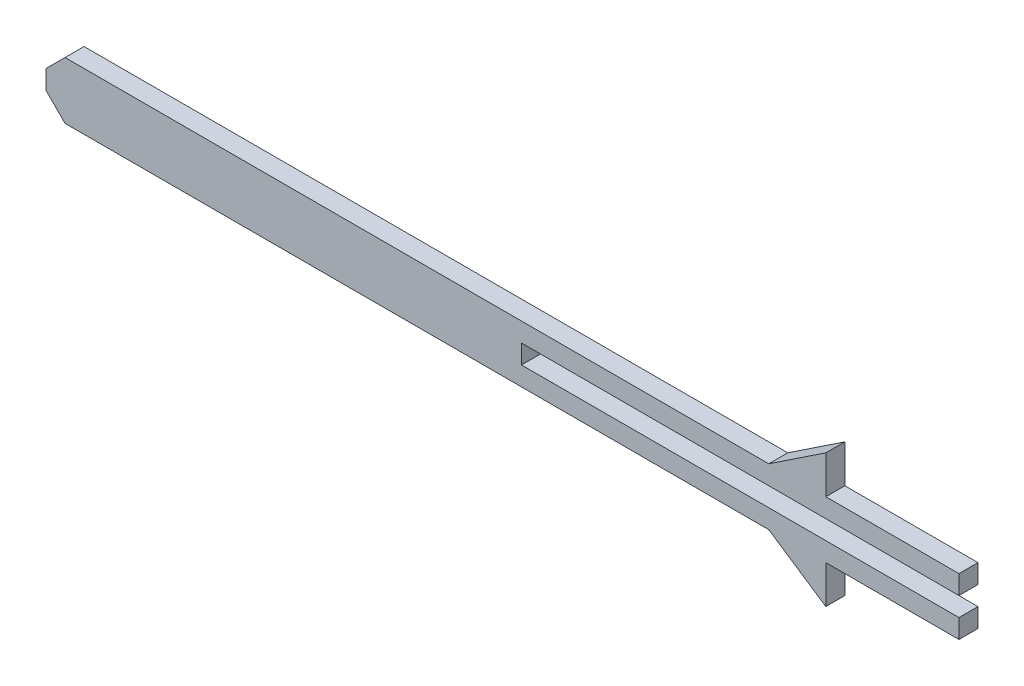
ISO-10303-21;
HEADER;
FILE_DESCRIPTION(('STEP AP214'),'2;1');
FILE_NAME('part.step','',(''),(''),'','','');
FILE_SCHEMA(('AUTOMOTIVE_DESIGN { 1 0 10303 214 1 1 1 1 }'));
ENDSEC;
DATA;
#1=APPLICATION_CONTEXT('core data for automotive mechanical design processes');
#2=APPLICATION_PROTOCOL_DEFINITION('international standard','automotive_design',2000,#1);
#3=PRODUCT_CONTEXT('',#1,'mechanical');
#4=PRODUCT('Part','Part','',(#3));
#5=PRODUCT_RELATED_PRODUCT_CATEGORY('part','',(#4));
#6=PRODUCT_DEFINITION_FORMATION('','',#4);
#7=PRODUCT_DEFINITION_CONTEXT('part definition',#1,'design');
#8=PRODUCT_DEFINITION('design','',#6,#7);
#9=PRODUCT_DEFINITION_SHAPE('','',#8);
#10=(LENGTH_UNIT() NAMED_UNIT(*) SI_UNIT(.MILLI.,.METRE.));
#11=(NAMED_UNIT(*) PLANE_ANGLE_UNIT() SI_UNIT($,.RADIAN.));
#12=(NAMED_UNIT(*) SI_UNIT($,.STERADIAN.) SOLID_ANGLE_UNIT());
#13=UNCERTAINTY_MEASURE_WITH_UNIT(LENGTH_MEASURE(1.E-05),#10,'distance_accuracy_value','');
#14=(GEOMETRIC_REPRESENTATION_CONTEXT(3) GLOBAL_UNCERTAINTY_ASSIGNED_CONTEXT((#13)) GLOBAL_UNIT_ASSIGNED_CONTEXT((#10,
#11,#12)) REPRESENTATION_CONTEXT('',''));
#15=CARTESIAN_POINT('',(0.,0.,0.));
#16=DIRECTION('',(0.,0.,1.));
#17=DIRECTION('',(1.,0.,0.));
#18=AXIS2_PLACEMENT_3D('',#15,#16,#17);
#19=CARTESIAN_POINT('',(492.942277064254,9.51412736958537,3.));
#20=DIRECTION('',(0.,1.,0.));
#21=DIRECTION('',(0.,0.,1.));
#22=AXIS2_PLACEMENT_3D('',#19,#20,#21);
#23=PLANE('',#22);
#24=DIRECTION('',(1.,0.,0.));
#25=VECTOR('',#24,1.);
#26=CARTESIAN_POINT('',(492.942277064254,9.51412736958537,0.));
#27=LINE('',#26,#25);
#28=CARTESIAN_POINT('',(471.942277064254,9.51412736958537,0.));
#29=VERTEX_POINT('',#28);
#30=CARTESIAN_POINT('',(492.942277064254,9.51412736958537,0.));
#31=VERTEX_POINT('',#30);
#32=EDGE_CURVE('E178',#29,#31,#27,.T.);
#33=ORIENTED_EDGE('',*,*,#32,.T.);
#34=DIRECTION('',(0.,0.,-1.));
#35=VECTOR('',#34,1.);
#36=CARTESIAN_POINT('',(492.942277064254,9.51412736958537,3.));
#37=LINE('',#36,#35);
#38=CARTESIAN_POINT('',(492.942277064254,9.51412736958537,3.));
#39=VERTEX_POINT('',#38);
#40=EDGE_CURVE('E11',#39,#31,#37,.T.);
#41=ORIENTED_EDGE('',*,*,#40,.F.);
#42=DIRECTION('',(1.,0.,0.));
#43=VECTOR('',#42,1.);
#44=CARTESIAN_POINT('',(492.942277064254,9.51412736958537,3.));
#45=LINE('',#44,#43);
#46=CARTESIAN_POINT('',(471.942277064254,9.51412736958537,3.));
#47=VERTEX_POINT('',#46);
#48=EDGE_CURVE('E208',#47,#39,#45,.T.);
#49=ORIENTED_EDGE('',*,*,#48,.F.);
#50=DIRECTION('',(0.,0.,-1.));
#51=VECTOR('',#50,1.);
#52=CARTESIAN_POINT('',(471.942277064254,9.51412736958537,3.));
#53=LINE('',#52,#51);
#54=EDGE_CURVE('E174',#47,#29,#53,.T.);
#55=ORIENTED_EDGE('',*,*,#54,.T.);
#56=EDGE_LOOP('',(#33,#41,#49,#55));
#57=FACE_BOUND('',#56,.T.);
#58=ADVANCED_FACE('F34',(#57),#23,.F.);
#59=CARTESIAN_POINT('',(492.942277064254,12.5141273695854,3.));
#60=DIRECTION('',(-1.,0.,0.));
#61=DIRECTION('',(0.,0.,1.));
#62=AXIS2_PLACEMENT_3D('',#59,#60,#61);
#63=PLANE('',#62);
#64=DIRECTION('',(0.,1.,0.));
#65=VECTOR('',#64,1.);
#66=CARTESIAN_POINT('',(492.942277064254,12.5141273695854,0.));
#67=LINE('',#66,#65);
#68=CARTESIAN_POINT('',(492.942277064254,12.5141273695854,0.));
#69=VERTEX_POINT('',#68);
#70=EDGE_CURVE('E181',#31,#69,#67,.T.);
#71=ORIENTED_EDGE('',*,*,#70,.T.);
#72=DIRECTION('',(0.,0.,-1.));
#73=VECTOR('',#72,1.);
#74=CARTESIAN_POINT('',(492.942277064254,12.5141273695854,3.));
#75=LINE('',#74,#73);
#76=CARTESIAN_POINT('',(492.942277064254,12.5141273695854,3.));
#77=VERTEX_POINT('',#76);
#78=EDGE_CURVE('E42',#77,#69,#75,.T.);
#79=ORIENTED_EDGE('',*,*,#78,.F.);
#80=DIRECTION('',(0.,1.,0.));
#81=VECTOR('',#80,1.);
#82=CARTESIAN_POINT('',(492.942277064254,12.5141273695854,3.));
#83=LINE('',#82,#81);
#84=EDGE_CURVE('E117',#39,#77,#83,.T.);
#85=ORIENTED_EDGE('',*,*,#84,.F.);
#86=ORIENTED_EDGE('',*,*,#40,.T.);
#87=EDGE_LOOP('',(#71,#79,#85,#86));
#88=FACE_BOUND('',#87,.T.);
#89=ADVANCED_FACE('F306',(#88),#63,.F.);
#90=CARTESIAN_POINT('',(423.942277064254,12.5141273695854,3.));
#91=DIRECTION('',(0.,-1.,0.));
#92=DIRECTION('',(0.,0.,-1.));
#93=AXIS2_PLACEMENT_3D('',#90,#91,#92);
#94=PLANE('',#93);
#95=DIRECTION('',(-1.,0.,0.));
#96=VECTOR('',#95,1.);
#97=CARTESIAN_POINT('',(423.942277064254,12.5141273695854,0.));
#98=LINE('',#97,#96);
#99=CARTESIAN_POINT('',(423.942277064254,12.5141273695854,0.));
#100=VERTEX_POINT('',#99);
#101=EDGE_CURVE('E183',#69,#100,#98,.T.);
#102=ORIENTED_EDGE('',*,*,#101,.T.);
#103=DIRECTION('',(0.,0.,-1.));
#104=VECTOR('',#103,1.);
#105=CARTESIAN_POINT('',(423.942277064254,12.5141273695854,3.));
#106=LINE('',#105,#104);
#107=CARTESIAN_POINT('',(423.942277064254,12.5141273695854,3.));
#108=VERTEX_POINT('',#107);
#109=EDGE_CURVE('E239',#108,#100,#106,.T.);
#110=ORIENTED_EDGE('',*,*,#109,.F.);
#111=DIRECTION('',(-1.,0.,0.));
#112=VECTOR('',#111,1.);
#113=CARTESIAN_POINT('',(423.942277064254,12.5141273695854,3.));
#114=LINE('',#113,#112);
#115=EDGE_CURVE('E247',#77,#108,#114,.T.);
#116=ORIENTED_EDGE('',*,*,#115,.F.);
#117=ORIENTED_EDGE('',*,*,#78,.T.);
#118=EDGE_LOOP('',(#102,#110,#116,#117));
#119=FACE_BOUND('',#118,.T.);
#120=ADVANCED_FACE('F245',(#119),#94,.F.);
#121=CARTESIAN_POINT('',(423.942277064254,15.5141273695854,3.));
#122=DIRECTION('',(-1.,0.,0.));
#123=DIRECTION('',(0.,0.,1.));
#124=AXIS2_PLACEMENT_3D('',#121,#122,#123);
#125=PLANE('',#124);
#126=DIRECTION('',(0.,1.,0.));
#127=VECTOR('',#126,1.);
#128=CARTESIAN_POINT('',(423.942277064254,15.5141273695854,0.));
#129=LINE('',#128,#127);
#130=CARTESIAN_POINT('',(423.942277064254,15.5141273695854,0.));
#131=VERTEX_POINT('',#130);
#132=EDGE_CURVE('E185',#100,#131,#129,.T.);
#133=ORIENTED_EDGE('',*,*,#132,.T.);
#134=DIRECTION('',(0.,0.,-1.));
#135=VECTOR('',#134,1.);
#136=CARTESIAN_POINT('',(423.942277064254,15.5141273695854,3.));
#137=LINE('',#136,#135);
#138=CARTESIAN_POINT('',(423.942277064254,15.5141273695854,3.));
#139=VERTEX_POINT('',#138);
#140=EDGE_CURVE('E236',#139,#131,#137,.T.);
#141=ORIENTED_EDGE('',*,*,#140,.F.);
#142=DIRECTION('',(0.,1.,0.));
#143=VECTOR('',#142,1.);
#144=CARTESIAN_POINT('',(423.942277064254,15.5141273695854,3.));
#145=LINE('',#144,#143);
#146=EDGE_CURVE('E265',#108,#139,#145,.T.);
#147=ORIENTED_EDGE('',*,*,#146,.F.);
#148=ORIENTED_EDGE('',*,*,#109,.T.);
#149=EDGE_LOOP('',(#133,#141,#147,#148));
#150=FACE_BOUND('',#149,.T.);
#151=ADVANCED_FACE('F256',(#150),#125,.F.);
#152=CARTESIAN_POINT('',(492.942277064254,15.5141273695854,3.));
#153=DIRECTION('',(0.,1.,0.));
#154=DIRECTION('',(0.,0.,1.));
#155=AXIS2_PLACEMENT_3D('',#152,#153,#154);
#156=PLANE('',#155);
#157=DIRECTION('',(1.,0.,0.));
#158=VECTOR('',#157,1.);
#159=CARTESIAN_POINT('',(492.942277064254,15.5141273695854,0.));
#160=LINE('',#159,#158);
#161=CARTESIAN_POINT('',(492.942277064254,15.5141273695854,0.));
#162=VERTEX_POINT('',#161);
#163=EDGE_CURVE('E187',#131,#162,#160,.T.);
#164=ORIENTED_EDGE('',*,*,#163,.T.);
#165=DIRECTION('',(0.,0.,-1.));
#166=VECTOR('',#165,1.);
#167=CARTESIAN_POINT('',(492.942277064254,15.5141273695854,3.));
#168=LINE('',#167,#166);
#169=CARTESIAN_POINT('',(492.942277064254,15.5141273695854,3.));
#170=VERTEX_POINT('',#169);
#171=EDGE_CURVE('E233',#170,#162,#168,.T.);
#172=ORIENTED_EDGE('',*,*,#171,.F.);
#173=DIRECTION('',(1.,0.,0.));
#174=VECTOR('',#173,1.);
#175=CARTESIAN_POINT('',(492.942277064254,15.5141273695854,3.));
#176=LINE('',#175,#174);
#177=EDGE_CURVE('E262',#139,#170,#176,.T.);
#178=ORIENTED_EDGE('',*,*,#177,.F.);
#179=ORIENTED_EDGE('',*,*,#140,.T.);
#180=EDGE_LOOP('',(#164,#172,#178,#179));
#181=FACE_BOUND('',#180,.T.);
#182=ADVANCED_FACE('F260',(#181),#156,.F.);
#183=CARTESIAN_POINT('',(492.942277064254,18.5141273695854,3.));
#184=DIRECTION('',(-1.,0.,0.));
#185=DIRECTION('',(0.,0.,1.));
#186=AXIS2_PLACEMENT_3D('',#183,#184,#185);
#187=PLANE('',#186);
#188=DIRECTION('',(0.,1.,0.));
#189=VECTOR('',#188,1.);
#190=CARTESIAN_POINT('',(492.942277064254,18.5141273695854,0.));
#191=LINE('',#190,#189);
#192=CARTESIAN_POINT('',(492.942277064254,18.5141273695854,0.));
#193=VERTEX_POINT('',#192);
#194=EDGE_CURVE('E189',#162,#193,#191,.T.);
#195=ORIENTED_EDGE('',*,*,#194,.T.);
#196=DIRECTION('',(0.,0.,-1.));
#197=VECTOR('',#196,1.);
#198=CARTESIAN_POINT('',(492.942277064254,18.5141273695854,3.));
#199=LINE('',#198,#197);
#200=CARTESIAN_POINT('',(492.942277064254,18.5141273695854,3.));
#201=VERTEX_POINT('',#200);
#202=EDGE_CURVE('E230',#201,#193,#199,.T.);
#203=ORIENTED_EDGE('',*,*,#202,.F.);
#204=DIRECTION('',(0.,1.,0.));
#205=VECTOR('',#204,1.);
#206=CARTESIAN_POINT('',(492.942277064254,18.5141273695854,3.));
#207=LINE('',#206,#205);
#208=EDGE_CURVE('E264',#170,#201,#207,.T.);
#209=ORIENTED_EDGE('',*,*,#208,.F.);
#210=ORIENTED_EDGE('',*,*,#171,.T.);
#211=EDGE_LOOP('',(#195,#203,#209,#210));
#212=FACE_BOUND('',#211,.T.);
#213=ADVANCED_FACE('F319',(#212),#187,.F.);
#214=CARTESIAN_POINT('',(471.942277064254,18.5141273695854,3.));
#215=DIRECTION('',(0.,-1.,0.));
#216=DIRECTION('',(0.,0.,-1.));
#217=AXIS2_PLACEMENT_3D('',#214,#215,#216);
#218=PLANE('',#217);
#219=DIRECTION('',(-1.,0.,0.));
#220=VECTOR('',#219,1.);
#221=CARTESIAN_POINT('',(471.942277064254,18.5141273695854,0.));
#222=LINE('',#221,#220);
#223=CARTESIAN_POINT('',(471.942277064254,18.5141273695854,0.));
#224=VERTEX_POINT('',#223);
#225=EDGE_CURVE('E191',#193,#224,#222,.T.);
#226=ORIENTED_EDGE('',*,*,#225,.T.);
#227=DIRECTION('',(0.,0.,-1.));
#228=VECTOR('',#227,1.);
#229=CARTESIAN_POINT('',(471.942277064254,18.5141273695854,3.));
#230=LINE('',#229,#228);
#231=CARTESIAN_POINT('',(471.942277064254,18.5141273695854,3.));
#232=VERTEX_POINT('',#231);
#233=EDGE_CURVE('E227',#232,#224,#230,.T.);
#234=ORIENTED_EDGE('',*,*,#233,.F.);
#235=DIRECTION('',(-1.,0.,0.));
#236=VECTOR('',#235,1.);
#237=CARTESIAN_POINT('',(471.942277064254,18.5141273695854,3.));
#238=LINE('',#237,#236);
#239=EDGE_CURVE('E267',#201,#232,#238,.T.);
#240=ORIENTED_EDGE('',*,*,#239,.F.);
#241=ORIENTED_EDGE('',*,*,#202,.T.);
#242=EDGE_LOOP('',(#226,#234,#240,#241));
#243=FACE_BOUND('',#242,.T.);
#244=ADVANCED_FACE('F322',(#243),#218,.F.);
#245=CARTESIAN_POINT('',(471.942277064254,24.5141273695854,3.));
#246=DIRECTION('',(-1.,0.,0.));
#247=DIRECTION('',(0.,0.,1.));
#248=AXIS2_PLACEMENT_3D('',#245,#246,#247);
#249=PLANE('',#248);
#250=DIRECTION('',(0.,1.,0.));
#251=VECTOR('',#250,1.);
#252=CARTESIAN_POINT('',(471.942277064254,24.5141273695854,0.));
#253=LINE('',#252,#251);
#254=CARTESIAN_POINT('',(471.942277064254,24.5141273695854,0.));
#255=VERTEX_POINT('',#254);
#256=EDGE_CURVE('E193',#224,#255,#253,.T.);
#257=ORIENTED_EDGE('',*,*,#256,.T.);
#258=DIRECTION('',(0.,0.,-1.));
#259=VECTOR('',#258,1.);
#260=CARTESIAN_POINT('',(471.942277064254,24.5141273695854,3.));
#261=LINE('',#260,#259);
#262=CARTESIAN_POINT('',(471.942277064254,24.5141273695854,3.));
#263=VERTEX_POINT('',#262);
#264=EDGE_CURVE('E224',#263,#255,#261,.T.);
#265=ORIENTED_EDGE('',*,*,#264,.F.);
#266=DIRECTION('',(0.,1.,0.));
#267=VECTOR('',#266,1.);
#268=CARTESIAN_POINT('',(471.942277064254,24.5141273695854,3.));
#269=LINE('',#268,#267);
#270=EDGE_CURVE('E273',#232,#263,#269,.T.);
#271=ORIENTED_EDGE('',*,*,#270,.F.);
#272=ORIENTED_EDGE('',*,*,#233,.T.);
#273=EDGE_LOOP('',(#257,#265,#271,#272));
#274=FACE_BOUND('',#273,.T.);
#275=ADVANCED_FACE('F326',(#274),#249,.F.);
#276=CARTESIAN_POINT('',(462.942277064254,18.5141273695854,3.));
#277=DIRECTION('',(0.554700196225231,-0.832050294337842,0.));
#278=DIRECTION('',(0.832050294337842,0.554700196225231,0.));
#279=AXIS2_PLACEMENT_3D('',#276,#277,#278);
#280=PLANE('',#279);
#281=DIRECTION('',(-0.832050294337842,-0.554700196225231,0.));
#282=VECTOR('',#281,1.);
#283=CARTESIAN_POINT('',(462.942277064254,18.5141273695854,0.));
#284=LINE('',#283,#282);
#285=CARTESIAN_POINT('',(462.942277064254,18.5141273695854,0.));
#286=VERTEX_POINT('',#285);
#287=EDGE_CURVE('E195',#255,#286,#284,.T.);
#288=ORIENTED_EDGE('',*,*,#287,.T.);
#289=DIRECTION('',(0.,0.,-1.));
#290=VECTOR('',#289,1.);
#291=CARTESIAN_POINT('',(462.942277064254,18.5141273695854,3.));
#292=LINE('',#291,#290);
#293=CARTESIAN_POINT('',(462.942277064254,18.5141273695854,3.));
#294=VERTEX_POINT('',#293);
#295=EDGE_CURVE('E221',#294,#286,#292,.T.);
#296=ORIENTED_EDGE('',*,*,#295,.F.);
#297=DIRECTION('',(-0.832050294337842,-0.554700196225231,0.));
#298=VECTOR('',#297,1.);
#299=CARTESIAN_POINT('',(462.942277064254,18.5141273695854,3.));
#300=LINE('',#299,#298);
#301=EDGE_CURVE('E275',#263,#294,#300,.T.);
#302=ORIENTED_EDGE('',*,*,#301,.F.);
#303=ORIENTED_EDGE('',*,*,#264,.T.);
#304=EDGE_LOOP('',(#288,#296,#302,#303));
#305=FACE_BOUND('',#304,.T.);
#306=ADVANCED_FACE('F330',(#305),#280,.F.);
#307=CARTESIAN_POINT('',(351.942277064254,18.5141273695854,3.));
#308=DIRECTION('',(0.,-1.,0.));
#309=DIRECTION('',(0.,0.,-1.));
#310=AXIS2_PLACEMENT_3D('',#307,#308,#309);
#311=PLANE('',#310);
#312=DIRECTION('',(-1.,0.,0.));
#313=VECTOR('',#312,1.);
#314=CARTESIAN_POINT('',(351.942277064254,18.5141273695854,0.));
#315=LINE('',#314,#313);
#316=CARTESIAN_POINT('',(351.942277064254,18.5141273695854,0.));
#317=VERTEX_POINT('',#316);
#318=EDGE_CURVE('E197',#286,#317,#315,.T.);
#319=ORIENTED_EDGE('',*,*,#318,.T.);
#320=DIRECTION('',(0.,0.,-1.));
#321=VECTOR('',#320,1.);
#322=CARTESIAN_POINT('',(351.942277064254,18.5141273695854,3.));
#323=LINE('',#322,#321);
#324=CARTESIAN_POINT('',(351.942277064254,18.5141273695854,3.));
#325=VERTEX_POINT('',#324);
#326=EDGE_CURVE('E218',#325,#317,#323,.T.);
#327=ORIENTED_EDGE('',*,*,#326,.F.);
#328=DIRECTION('',(-1.,0.,0.));
#329=VECTOR('',#328,1.);
#330=CARTESIAN_POINT('',(351.942277064254,18.5141273695854,3.));
#331=LINE('',#330,#329);
#332=EDGE_CURVE('E277',#294,#325,#331,.T.);
#333=ORIENTED_EDGE('',*,*,#332,.F.);
#334=ORIENTED_EDGE('',*,*,#295,.T.);
#335=EDGE_LOOP('',(#319,#327,#333,#334));
#336=FACE_BOUND('',#335,.T.);
#337=ADVANCED_FACE('F334',(#336),#311,.F.);
#338=CARTESIAN_POINT('',(348.942277064254,15.5141273695854,3.));
#339=DIRECTION('',(0.707106781186547,-0.707106781186548,0.));
#340=DIRECTION('',(0.707106781186548,0.707106781186547,0.));
#341=AXIS2_PLACEMENT_3D('',#338,#339,#340);
#342=PLANE('',#341);
#343=DIRECTION('',(-0.707106781186548,-0.707106781186547,0.));
#344=VECTOR('',#343,1.);
#345=CARTESIAN_POINT('',(348.942277064254,15.5141273695854,0.));
#346=LINE('',#345,#344);
#347=CARTESIAN_POINT('',(348.942277064254,15.5141273695854,0.));
#348=VERTEX_POINT('',#347);
#349=EDGE_CURVE('E199',#317,#348,#346,.T.);
#350=ORIENTED_EDGE('',*,*,#349,.T.);
#351=DIRECTION('',(0.,0.,-1.));
#352=VECTOR('',#351,1.);
#353=CARTESIAN_POINT('',(348.942277064254,15.5141273695854,3.));
#354=LINE('',#353,#352);
#355=CARTESIAN_POINT('',(348.942277064254,15.5141273695854,3.));
#356=VERTEX_POINT('',#355);
#357=EDGE_CURVE('E215',#356,#348,#354,.T.);
#358=ORIENTED_EDGE('',*,*,#357,.F.);
#359=DIRECTION('',(-0.707106781186548,-0.707106781186547,0.));
#360=VECTOR('',#359,1.);
#361=CARTESIAN_POINT('',(348.942277064254,15.5141273695854,3.));
#362=LINE('',#361,#360);
#363=EDGE_CURVE('E279',#325,#356,#362,.T.);
#364=ORIENTED_EDGE('',*,*,#363,.F.);
#365=ORIENTED_EDGE('',*,*,#326,.T.);
#366=EDGE_LOOP('',(#350,#358,#364,#365));
#367=FACE_BOUND('',#366,.T.);
#368=ADVANCED_FACE('F338',(#367),#342,.F.);
#369=CARTESIAN_POINT('',(348.942277064254,12.5141273695854,3.));
#370=DIRECTION('',(1.,0.,0.));
#371=DIRECTION('',(0.,0.,-1.));
#372=AXIS2_PLACEMENT_3D('',#369,#370,#371);
#373=PLANE('',#372);
#374=DIRECTION('',(0.,-1.,0.));
#375=VECTOR('',#374,1.);
#376=CARTESIAN_POINT('',(348.942277064254,12.5141273695854,0.));
#377=LINE('',#376,#375);
#378=CARTESIAN_POINT('',(348.942277064254,12.5141273695854,0.));
#379=VERTEX_POINT('',#378);
#380=EDGE_CURVE('E201',#348,#379,#377,.T.);
#381=ORIENTED_EDGE('',*,*,#380,.T.);
#382=DIRECTION('',(0.,0.,-1.));
#383=VECTOR('',#382,1.);
#384=CARTESIAN_POINT('',(348.942277064254,12.5141273695854,3.));
#385=LINE('',#384,#383);
#386=CARTESIAN_POINT('',(348.942277064254,12.5141273695854,3.));
#387=VERTEX_POINT('',#386);
#388=EDGE_CURVE('E212',#387,#379,#385,.T.);
#389=ORIENTED_EDGE('',*,*,#388,.F.);
#390=DIRECTION('',(0.,-1.,0.));
#391=VECTOR('',#390,1.);
#392=CARTESIAN_POINT('',(348.942277064254,12.5141273695854,3.));
#393=LINE('',#392,#391);
#394=EDGE_CURVE('E281',#356,#387,#393,.T.);
#395=ORIENTED_EDGE('',*,*,#394,.F.);
#396=ORIENTED_EDGE('',*,*,#357,.T.);
#397=EDGE_LOOP('',(#381,#389,#395,#396));
#398=FACE_BOUND('',#397,.T.);
#399=ADVANCED_FACE('F287',(#398),#373,.F.);
#400=CARTESIAN_POINT('',(351.942277064254,9.51412736958537,3.));
#401=DIRECTION('',(0.707106781186547,0.707106781186548,0.));
#402=DIRECTION('',(-0.707106781186548,0.707106781186547,0.));
#403=AXIS2_PLACEMENT_3D('',#400,#401,#402);
#404=PLANE('',#403);
#405=DIRECTION('',(0.707106781186548,-0.707106781186547,0.));
#406=VECTOR('',#405,1.);
#407=CARTESIAN_POINT('',(351.942277064254,9.51412736958537,0.));
#408=LINE('',#407,#406);
#409=CARTESIAN_POINT('',(351.942277064254,9.51412736958537,0.));
#410=VERTEX_POINT('',#409);
#411=EDGE_CURVE('E203',#379,#410,#408,.T.);
#412=ORIENTED_EDGE('',*,*,#411,.T.);
#413=DIRECTION('',(0.,0.,-1.));
#414=VECTOR('',#413,1.);
#415=CARTESIAN_POINT('',(351.942277064254,9.51412736958537,3.));
#416=LINE('',#415,#414);
#417=CARTESIAN_POINT('',(351.942277064254,9.51412736958537,3.));
#418=VERTEX_POINT('',#417);
#419=EDGE_CURVE('E169',#418,#410,#416,.T.);
#420=ORIENTED_EDGE('',*,*,#419,.F.);
#421=DIRECTION('',(0.707106781186548,-0.707106781186547,0.));
#422=VECTOR('',#421,1.);
#423=CARTESIAN_POINT('',(351.942277064254,9.51412736958537,3.));
#424=LINE('',#423,#422);
#425=EDGE_CURVE('E160',#387,#418,#424,.T.);
#426=ORIENTED_EDGE('',*,*,#425,.F.);
#427=ORIENTED_EDGE('',*,*,#388,.T.);
#428=EDGE_LOOP('',(#412,#420,#426,#427));
#429=FACE_BOUND('',#428,.T.);
#430=ADVANCED_FACE('F291',(#429),#404,.F.);
#431=CARTESIAN_POINT('',(462.942277064254,9.51412736958537,3.));
#432=DIRECTION('',(0.,1.,0.));
#433=DIRECTION('',(0.,0.,1.));
#434=AXIS2_PLACEMENT_3D('',#431,#432,#433);
#435=PLANE('',#434);
#436=DIRECTION('',(1.,0.,0.));
#437=VECTOR('',#436,1.);
#438=CARTESIAN_POINT('',(462.942277064254,9.51412736958537,0.));
#439=LINE('',#438,#437);
#440=CARTESIAN_POINT('',(462.942277064254,9.51412736958537,0.));
#441=VERTEX_POINT('',#440);
#442=EDGE_CURVE('E168',#410,#441,#439,.T.);
#443=ORIENTED_EDGE('',*,*,#442,.T.);
#444=DIRECTION('',(0.,0.,-1.));
#445=VECTOR('',#444,1.);
#446=CARTESIAN_POINT('',(462.942277064254,9.51412736958537,3.));
#447=LINE('',#446,#445);
#448=CARTESIAN_POINT('',(462.942277064254,9.51412736958537,3.));
#449=VERTEX_POINT('',#448);
#450=EDGE_CURVE('E165',#449,#441,#447,.T.);
#451=ORIENTED_EDGE('',*,*,#450,.F.);
#452=DIRECTION('',(1.,0.,0.));
#453=VECTOR('',#452,1.);
#454=CARTESIAN_POINT('',(462.942277064254,9.51412736958537,3.));
#455=LINE('',#454,#453);
#456=EDGE_CURVE('E154',#418,#449,#455,.T.);
#457=ORIENTED_EDGE('',*,*,#456,.F.);
#458=ORIENTED_EDGE('',*,*,#419,.T.);
#459=EDGE_LOOP('',(#443,#451,#457,#458));
#460=FACE_BOUND('',#459,.T.);
#461=ADVANCED_FACE('F166',(#460),#435,.F.);
#462=CARTESIAN_POINT('',(471.942277064254,3.51412736958537,3.));
#463=DIRECTION('',(0.554700196225231,0.832050294337842,0.));
#464=DIRECTION('',(-0.832050294337842,0.554700196225231,0.));
#465=AXIS2_PLACEMENT_3D('',#462,#463,#464);
#466=PLANE('',#465);
#467=DIRECTION('',(0.832050294337842,-0.554700196225231,0.));
#468=VECTOR('',#467,1.);
#469=CARTESIAN_POINT('',(471.942277064254,3.51412736958537,0.));
#470=LINE('',#469,#468);
#471=CARTESIAN_POINT('',(471.942277064254,3.51412736958537,0.));
#472=VERTEX_POINT('',#471);
#473=EDGE_CURVE('E103',#441,#472,#470,.T.);
#474=ORIENTED_EDGE('',*,*,#473,.T.);
#475=DIRECTION('',(0.,0.,-1.));
#476=VECTOR('',#475,1.);
#477=CARTESIAN_POINT('',(471.942277064254,3.51412736958537,3.));
#478=LINE('',#477,#476);
#479=CARTESIAN_POINT('',(471.942277064254,3.51412736958537,3.));
#480=VERTEX_POINT('',#479);
#481=EDGE_CURVE('E170',#480,#472,#478,.T.);
#482=ORIENTED_EDGE('',*,*,#481,.F.);
#483=DIRECTION('',(0.832050294337842,-0.554700196225231,0.));
#484=VECTOR('',#483,1.);
#485=CARTESIAN_POINT('',(471.942277064254,3.51412736958537,3.));
#486=LINE('',#485,#484);
#487=EDGE_CURVE('E158',#449,#480,#486,.T.);
#488=ORIENTED_EDGE('',*,*,#487,.F.);
#489=ORIENTED_EDGE('',*,*,#450,.T.);
#490=EDGE_LOOP('',(#474,#482,#488,#489));
#491=FACE_BOUND('',#490,.T.);
#492=ADVANCED_FACE('F172',(#491),#466,.F.);
#493=CARTESIAN_POINT('',(471.942277064254,9.51412736958537,3.));
#494=DIRECTION('',(-1.,0.,0.));
#495=DIRECTION('',(0.,0.,1.));
#496=AXIS2_PLACEMENT_3D('',#493,#494,#495);
#497=PLANE('',#496);
#498=DIRECTION('',(0.,1.,0.));
#499=VECTOR('',#498,1.);
#500=CARTESIAN_POINT('',(471.942277064254,9.51412736958537,0.));
#501=LINE('',#500,#499);
#502=EDGE_CURVE('E109',#472,#29,#501,.T.);
#503=ORIENTED_EDGE('',*,*,#502,.T.);
#504=ORIENTED_EDGE('',*,*,#54,.F.);
#505=DIRECTION('',(0.,1.,0.));
#506=VECTOR('',#505,1.);
#507=CARTESIAN_POINT('',(471.942277064254,9.51412736958537,3.));
#508=LINE('',#507,#506);
#509=EDGE_CURVE('E50',#480,#47,#508,.T.);
#510=ORIENTED_EDGE('',*,*,#509,.F.);
#511=ORIENTED_EDGE('',*,*,#481,.T.);
#512=EDGE_LOOP('',(#503,#504,#510,#511));
#513=FACE_BOUND('',#512,.T.);
#514=ADVANCED_FACE('F295',(#513),#497,.F.);
#515=CARTESIAN_POINT('',(0.,0.,3.));
#516=DIRECTION('',(0.,0.,1.));
#517=DIRECTION('',(1.,0.,0.));
#518=AXIS2_PLACEMENT_3D('',#515,#516,#517);
#519=PLANE('',#518);
#520=ORIENTED_EDGE('',*,*,#48,.T.);
#521=ORIENTED_EDGE('',*,*,#84,.T.);
#522=ORIENTED_EDGE('',*,*,#115,.T.);
#523=ORIENTED_EDGE('',*,*,#146,.T.);
#524=ORIENTED_EDGE('',*,*,#177,.T.);
#525=ORIENTED_EDGE('',*,*,#208,.T.);
#526=ORIENTED_EDGE('',*,*,#239,.T.);
#527=ORIENTED_EDGE('',*,*,#270,.T.);
#528=ORIENTED_EDGE('',*,*,#301,.T.);
#529=ORIENTED_EDGE('',*,*,#332,.T.);
#530=ORIENTED_EDGE('',*,*,#363,.T.);
#531=ORIENTED_EDGE('',*,*,#394,.T.);
#532=ORIENTED_EDGE('',*,*,#425,.T.);
#533=ORIENTED_EDGE('',*,*,#456,.T.);
#534=ORIENTED_EDGE('',*,*,#487,.T.);
#535=ORIENTED_EDGE('',*,*,#509,.T.);
#536=EDGE_LOOP('',(#520,#521,#522,#523,#524,#525,#526,#527,#528,#529,#530,#531,#532,#533,#534,#535));
#537=FACE_BOUND('',#536,.T.);
#538=ADVANCED_FACE('F156',(#537),#519,.T.);
#539=CARTESIAN_POINT('',(0.,0.,0.));
#540=DIRECTION('',(0.,0.,1.));
#541=DIRECTION('',(1.,0.,0.));
#542=AXIS2_PLACEMENT_3D('',#539,#540,#541);
#543=PLANE('',#542);
#544=ORIENTED_EDGE('',*,*,#32,.F.);
#545=ORIENTED_EDGE('',*,*,#502,.F.);
#546=ORIENTED_EDGE('',*,*,#473,.F.);
#547=ORIENTED_EDGE('',*,*,#442,.F.);
#548=ORIENTED_EDGE('',*,*,#411,.F.);
#549=ORIENTED_EDGE('',*,*,#380,.F.);
#550=ORIENTED_EDGE('',*,*,#349,.F.);
#551=ORIENTED_EDGE('',*,*,#318,.F.);
#552=ORIENTED_EDGE('',*,*,#287,.F.);
#553=ORIENTED_EDGE('',*,*,#256,.F.);
#554=ORIENTED_EDGE('',*,*,#225,.F.);
#555=ORIENTED_EDGE('',*,*,#194,.F.);
#556=ORIENTED_EDGE('',*,*,#163,.F.);
#557=ORIENTED_EDGE('',*,*,#132,.F.);
#558=ORIENTED_EDGE('',*,*,#101,.F.);
#559=ORIENTED_EDGE('',*,*,#70,.F.);
#560=EDGE_LOOP('',(#544,#545,#546,#547,#548,#549,#550,#551,#552,#553,#554,#555,#556,#557,#558,#559));
#561=FACE_BOUND('',#560,.T.);
#562=ADVANCED_FACE('F251',(#561),#543,.F.);
#563=CLOSED_SHELL('',(#58,#89,#120,#151,#182,#213,#244,#275,#306,#337,#368,#399,#430,#461,#492,
#514,#538,#562));
#564=MANIFOLD_SOLID_BREP('B2',#563);
#565=ADVANCED_BREP_SHAPE_REPRESENTATION('',(#18,#564),#14);
#566=SHAPE_DEFINITION_REPRESENTATION(#9,#565);
ENDSEC;
END-ISO-10303-21;
